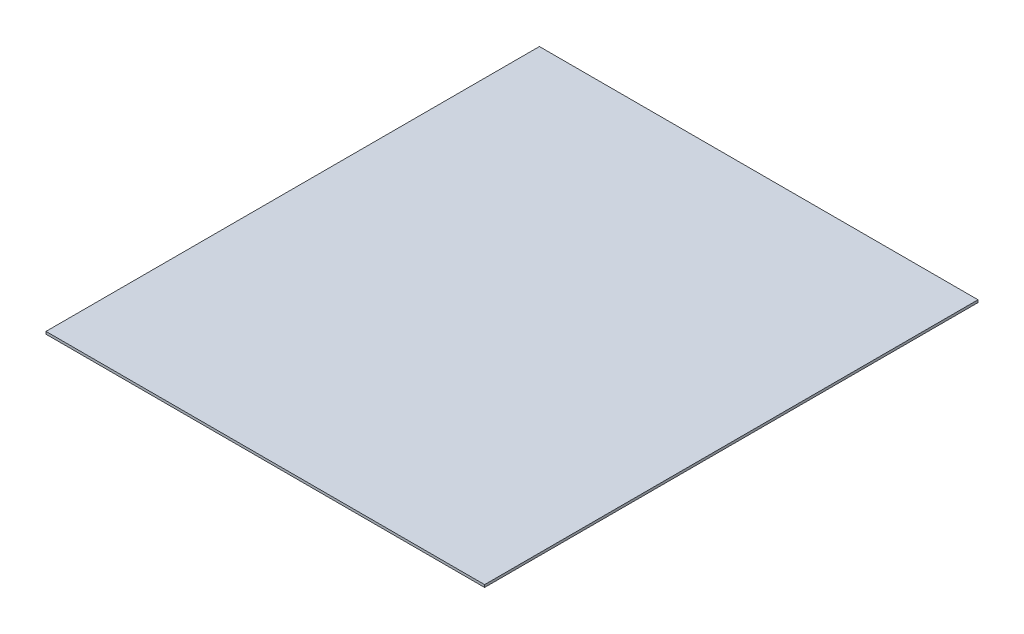
ISO-10303-21;
HEADER;
FILE_DESCRIPTION(('STEP AP214'),'2;1');
FILE_NAME('part.step','',(''),(''),'','','');
FILE_SCHEMA(('AUTOMOTIVE_DESIGN { 1 0 10303 214 1 1 1 1 }'));
ENDSEC;
DATA;
#1=APPLICATION_CONTEXT('core data for automotive mechanical design processes');
#2=APPLICATION_PROTOCOL_DEFINITION('international standard','automotive_design',2000,#1);
#3=PRODUCT_CONTEXT('',#1,'mechanical');
#4=PRODUCT('Part','Part','',(#3));
#5=PRODUCT_RELATED_PRODUCT_CATEGORY('part','',(#4));
#6=PRODUCT_DEFINITION_FORMATION('','',#4);
#7=PRODUCT_DEFINITION_CONTEXT('part definition',#1,'design');
#8=PRODUCT_DEFINITION('design','',#6,#7);
#9=PRODUCT_DEFINITION_SHAPE('','',#8);
#10=(LENGTH_UNIT() NAMED_UNIT(*) SI_UNIT(.MILLI.,.METRE.));
#11=(NAMED_UNIT(*) PLANE_ANGLE_UNIT() SI_UNIT($,.RADIAN.));
#12=(NAMED_UNIT(*) SI_UNIT($,.STERADIAN.) SOLID_ANGLE_UNIT());
#13=UNCERTAINTY_MEASURE_WITH_UNIT(LENGTH_MEASURE(1.E-05),#10,'distance_accuracy_value','');
#14=(GEOMETRIC_REPRESENTATION_CONTEXT(3) GLOBAL_UNCERTAINTY_ASSIGNED_CONTEXT((#13)) GLOBAL_UNIT_ASSIGNED_CONTEXT((#10,
#11,#12)) REPRESENTATION_CONTEXT('',''));
#15=CARTESIAN_POINT('',(0.,0.,0.));
#16=DIRECTION('',(0.,0.,1.));
#17=DIRECTION('',(1.,0.,0.));
#18=AXIS2_PLACEMENT_3D('',#15,#16,#17);
#19=CARTESIAN_POINT('',(560.475,6.35,630.475));
#20=DIRECTION('',(-1.,0.,0.));
#21=DIRECTION('',(0.,0.,1.));
#22=AXIS2_PLACEMENT_3D('',#19,#20,#21);
#23=PLANE('',#22);
#24=DIRECTION('',(0.,0.,-1.));
#25=VECTOR('',#24,1.);
#26=CARTESIAN_POINT('',(560.475,0.,630.475));
#27=LINE('',#26,#25);
#28=CARTESIAN_POINT('',(560.475,0.,630.475));
#29=VERTEX_POINT('',#28);
#30=CARTESIAN_POINT('',(560.475,0.,-630.475));
#31=VERTEX_POINT('',#30);
#32=EDGE_CURVE('E100',#29,#31,#27,.T.);
#33=ORIENTED_EDGE('',*,*,#32,.T.);
#34=DIRECTION('',(0.,-1.,0.));
#35=VECTOR('',#34,1.);
#36=CARTESIAN_POINT('',(560.475,6.35,-630.475));
#37=LINE('',#36,#35);
#38=CARTESIAN_POINT('',(560.475,6.35,-630.475));
#39=VERTEX_POINT('',#38);
#40=EDGE_CURVE('E11',#39,#31,#37,.T.);
#41=ORIENTED_EDGE('',*,*,#40,.F.);
#42=DIRECTION('',(0.,0.,-1.));
#43=VECTOR('',#42,1.);
#44=CARTESIAN_POINT('',(560.475,6.35,630.475));
#45=LINE('',#44,#43);
#46=CARTESIAN_POINT('',(560.475,6.35,630.475));
#47=VERTEX_POINT('',#46);
#48=EDGE_CURVE('E88',#47,#39,#45,.T.);
#49=ORIENTED_EDGE('',*,*,#48,.F.);
#50=DIRECTION('',(0.,-1.,0.));
#51=VECTOR('',#50,1.);
#52=CARTESIAN_POINT('',(560.475,6.35,630.475));
#53=LINE('',#52,#51);
#54=EDGE_CURVE('E96',#47,#29,#53,.T.);
#55=ORIENTED_EDGE('',*,*,#54,.T.);
#56=EDGE_LOOP('',(#33,#41,#49,#55));
#57=FACE_BOUND('',#56,.T.);
#58=ADVANCED_FACE('F37',(#57),#23,.F.);
#59=CARTESIAN_POINT('',(-560.475,6.35,-630.475));
#60=DIRECTION('',(0.,0.,1.));
#61=DIRECTION('',(1.,0.,0.));
#62=AXIS2_PLACEMENT_3D('',#59,#60,#61);
#63=PLANE('',#62);
#64=DIRECTION('',(-1.,0.,0.));
#65=VECTOR('',#64,1.);
#66=CARTESIAN_POINT('',(-560.475,0.,-630.475));
#67=LINE('',#66,#65);
#68=CARTESIAN_POINT('',(-560.475,0.,-630.475));
#69=VERTEX_POINT('',#68);
#70=EDGE_CURVE('E92',#31,#69,#67,.T.);
#71=ORIENTED_EDGE('',*,*,#70,.T.);
#72=DIRECTION('',(0.,-1.,0.));
#73=VECTOR('',#72,1.);
#74=CARTESIAN_POINT('',(-560.475,6.35,-630.475));
#75=LINE('',#74,#73);
#76=CARTESIAN_POINT('',(-560.475,6.35,-630.475));
#77=VERTEX_POINT('',#76);
#78=EDGE_CURVE('E45',#77,#69,#75,.T.);
#79=ORIENTED_EDGE('',*,*,#78,.F.);
#80=DIRECTION('',(-1.,0.,0.));
#81=VECTOR('',#80,1.);
#82=CARTESIAN_POINT('',(-560.475,6.35,-630.475));
#83=LINE('',#82,#81);
#84=EDGE_CURVE('E83',#39,#77,#83,.T.);
#85=ORIENTED_EDGE('',*,*,#84,.F.);
#86=ORIENTED_EDGE('',*,*,#40,.T.);
#87=EDGE_LOOP('',(#71,#79,#85,#86));
#88=FACE_BOUND('',#87,.T.);
#89=ADVANCED_FACE('F91',(#88),#63,.F.);
#90=CARTESIAN_POINT('',(-560.475,6.35,630.475));
#91=DIRECTION('',(1.,0.,0.));
#92=DIRECTION('',(0.,0.,-1.));
#93=AXIS2_PLACEMENT_3D('',#90,#91,#92);
#94=PLANE('',#93);
#95=DIRECTION('',(0.,0.,1.));
#96=VECTOR('',#95,1.);
#97=CARTESIAN_POINT('',(-560.475,0.,630.475));
#98=LINE('',#97,#96);
#99=CARTESIAN_POINT('',(-560.475,0.,630.475));
#100=VERTEX_POINT('',#99);
#101=EDGE_CURVE('E70',#69,#100,#98,.T.);
#102=ORIENTED_EDGE('',*,*,#101,.T.);
#103=DIRECTION('',(0.,-1.,0.));
#104=VECTOR('',#103,1.);
#105=CARTESIAN_POINT('',(-560.475,6.35,630.475));
#106=LINE('',#105,#104);
#107=CARTESIAN_POINT('',(-560.475,6.35,630.475));
#108=VERTEX_POINT('',#107);
#109=EDGE_CURVE('E93',#108,#100,#106,.T.);
#110=ORIENTED_EDGE('',*,*,#109,.F.);
#111=DIRECTION('',(0.,0.,1.));
#112=VECTOR('',#111,1.);
#113=CARTESIAN_POINT('',(-560.475,6.35,630.475));
#114=LINE('',#113,#112);
#115=EDGE_CURVE('E86',#77,#108,#114,.T.);
#116=ORIENTED_EDGE('',*,*,#115,.F.);
#117=ORIENTED_EDGE('',*,*,#78,.T.);
#118=EDGE_LOOP('',(#102,#110,#116,#117));
#119=FACE_BOUND('',#118,.T.);
#120=ADVANCED_FACE('F94',(#119),#94,.F.);
#121=CARTESIAN_POINT('',(-560.475,6.35,630.475));
#122=DIRECTION('',(0.,0.,-1.));
#123=DIRECTION('',(-1.,0.,0.));
#124=AXIS2_PLACEMENT_3D('',#121,#122,#123);
#125=PLANE('',#124);
#126=DIRECTION('',(1.,0.,0.));
#127=VECTOR('',#126,1.);
#128=CARTESIAN_POINT('',(-560.475,0.,630.475));
#129=LINE('',#128,#127);
#130=EDGE_CURVE('E76',#100,#29,#129,.T.);
#131=ORIENTED_EDGE('',*,*,#130,.T.);
#132=ORIENTED_EDGE('',*,*,#54,.F.);
#133=DIRECTION('',(1.,0.,0.));
#134=VECTOR('',#133,1.);
#135=CARTESIAN_POINT('',(-560.475,6.35,630.475));
#136=LINE('',#135,#134);
#137=EDGE_CURVE('E53',#108,#47,#136,.T.);
#138=ORIENTED_EDGE('',*,*,#137,.F.);
#139=ORIENTED_EDGE('',*,*,#109,.T.);
#140=EDGE_LOOP('',(#131,#132,#138,#139));
#141=FACE_BOUND('',#140,.T.);
#142=ADVANCED_FACE('F107',(#141),#125,.F.);
#143=CARTESIAN_POINT('',(0.,6.35,0.));
#144=DIRECTION('',(0.,-1.,0.));
#145=DIRECTION('',(0.,0.,-1.));
#146=AXIS2_PLACEMENT_3D('',#143,#144,#145);
#147=PLANE('',#146);
#148=ORIENTED_EDGE('',*,*,#48,.T.);
#149=ORIENTED_EDGE('',*,*,#84,.T.);
#150=ORIENTED_EDGE('',*,*,#115,.T.);
#151=ORIENTED_EDGE('',*,*,#137,.T.);
#152=EDGE_LOOP('',(#148,#149,#150,#151));
#153=FACE_BOUND('',#152,.T.);
#154=ADVANCED_FACE('F84',(#153),#147,.F.);
#155=CARTESIAN_POINT('',(0.,0.,0.));
#156=DIRECTION('',(0.,-1.,0.));
#157=DIRECTION('',(0.,0.,-1.));
#158=AXIS2_PLACEMENT_3D('',#155,#156,#157);
#159=PLANE('',#158);
#160=ORIENTED_EDGE('',*,*,#32,.F.);
#161=ORIENTED_EDGE('',*,*,#130,.F.);
#162=ORIENTED_EDGE('',*,*,#101,.F.);
#163=ORIENTED_EDGE('',*,*,#70,.F.);
#164=EDGE_LOOP('',(#160,#161,#162,#163));
#165=FACE_BOUND('',#164,.T.);
#166=ADVANCED_FACE('F110',(#165),#159,.T.);
#167=CLOSED_SHELL('',(#58,#89,#120,#142,#154,#166));
#168=MANIFOLD_SOLID_BREP('B2',#167);
#169=ADVANCED_BREP_SHAPE_REPRESENTATION('',(#18,#168),#14);
#170=SHAPE_DEFINITION_REPRESENTATION(#9,#169);
ENDSEC;
END-ISO-10303-21;
